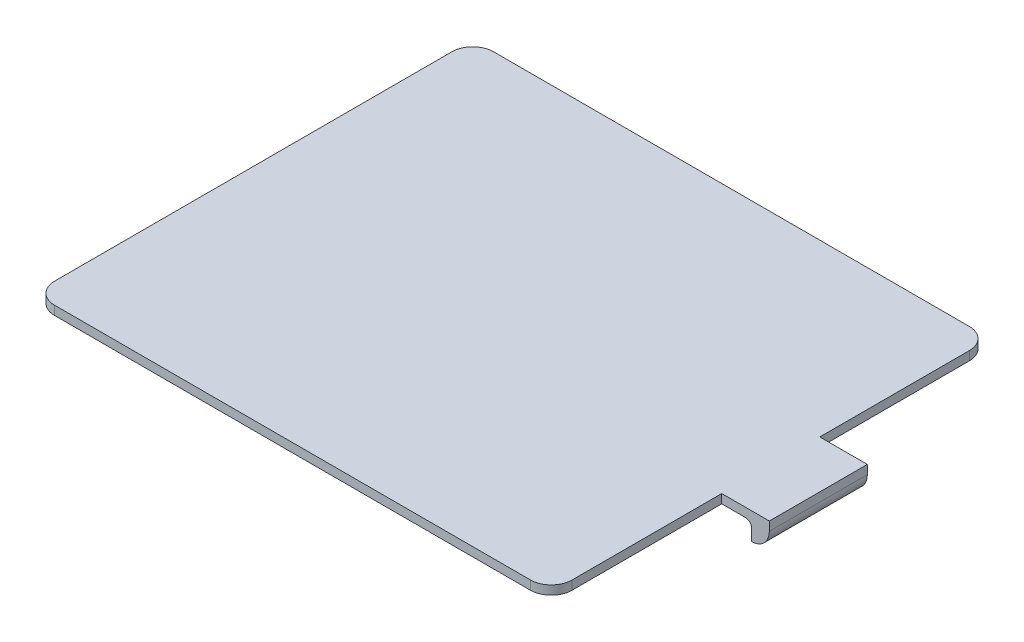
ISO-10303-21;
HEADER;
FILE_DESCRIPTION(('STEP AP214'),'2;1');
FILE_NAME('part.step','',(''),(''),'','','');
FILE_SCHEMA(('AUTOMOTIVE_DESIGN { 1 0 10303 214 1 1 1 1 }'));
ENDSEC;
DATA;
#1=APPLICATION_CONTEXT('core data for automotive mechanical design processes');
#2=APPLICATION_PROTOCOL_DEFINITION('international standard','automotive_design',2000,#1);
#3=PRODUCT_CONTEXT('',#1,'mechanical');
#4=PRODUCT('Part','Part','',(#3));
#5=PRODUCT_RELATED_PRODUCT_CATEGORY('part','',(#4));
#6=PRODUCT_DEFINITION_FORMATION('','',#4);
#7=PRODUCT_DEFINITION_CONTEXT('part definition',#1,'design');
#8=PRODUCT_DEFINITION('design','',#6,#7);
#9=PRODUCT_DEFINITION_SHAPE('','',#8);
#10=(LENGTH_UNIT() NAMED_UNIT(*) SI_UNIT(.MILLI.,.METRE.));
#11=(NAMED_UNIT(*) PLANE_ANGLE_UNIT() SI_UNIT($,.RADIAN.));
#12=(NAMED_UNIT(*) SI_UNIT($,.STERADIAN.) SOLID_ANGLE_UNIT());
#13=UNCERTAINTY_MEASURE_WITH_UNIT(LENGTH_MEASURE(1.E-05),#10,'distance_accuracy_value','');
#14=(GEOMETRIC_REPRESENTATION_CONTEXT(3) GLOBAL_UNCERTAINTY_ASSIGNED_CONTEXT((#13)) GLOBAL_UNIT_ASSIGNED_CONTEXT((#10,
#11,#12)) REPRESENTATION_CONTEXT('',''));
#15=CARTESIAN_POINT('',(0.,0.,0.));
#16=DIRECTION('',(0.,0.,1.));
#17=DIRECTION('',(1.,0.,0.));
#18=AXIS2_PLACEMENT_3D('',#15,#16,#17);
#19=CARTESIAN_POINT('',(104.902209804421,-36.5,-27.5536747118102));
#20=DIRECTION('',(1.,0.,0.));
#21=DIRECTION('',(0.,0.,-1.));
#22=AXIS2_PLACEMENT_3D('',#19,#20,#21);
#23=PLANE('',#22);
#24=DIRECTION('',(0.,0.,-1.));
#25=VECTOR('',#24,1.);
#26=CARTESIAN_POINT('',(104.902209804421,-35.,-27.5536747118102));
#27=LINE('',#26,#25);
#28=CARTESIAN_POINT('',(104.902209804421,-35.,-2.37681307845837));
#29=VERTEX_POINT('',#28);
#30=CARTESIAN_POINT('',(104.902209804421,-35.,-27.5536747118102));
#31=VERTEX_POINT('',#30);
#32=EDGE_CURVE('E229',#29,#31,#27,.T.);
#33=ORIENTED_EDGE('',*,*,#32,.F.);
#34=DIRECTION('',(0.,1.,0.));
#35=VECTOR('',#34,1.);
#36=CARTESIAN_POINT('',(104.902209804421,-35.,-2.37681307845836));
#37=LINE('',#36,#35);
#38=CARTESIAN_POINT('',(104.902209804421,-36.5,-2.37681307845836));
#39=VERTEX_POINT('',#38);
#40=EDGE_CURVE('E166',#39,#29,#37,.T.);
#41=ORIENTED_EDGE('',*,*,#40,.F.);
#42=DIRECTION('',(0.,0.,-1.));
#43=VECTOR('',#42,1.);
#44=CARTESIAN_POINT('',(104.902209804421,-36.5,-27.5536747118102));
#45=LINE('',#44,#43);
#46=CARTESIAN_POINT('',(104.902209804421,-36.5,-27.5536747118102));
#47=VERTEX_POINT('',#46);
#48=EDGE_CURVE('E204',#39,#47,#45,.T.);
#49=ORIENTED_EDGE('',*,*,#48,.T.);
#50=DIRECTION('',(0.,1.,0.));
#51=VECTOR('',#50,1.);
#52=CARTESIAN_POINT('',(104.902209804421,-36.5,-27.5536747118102));
#53=LINE('',#52,#51);
#54=EDGE_CURVE('E243',#47,#31,#53,.T.);
#55=ORIENTED_EDGE('',*,*,#54,.T.);
#56=EDGE_LOOP('',(#33,#41,#49,#55));
#57=FACE_BOUND('',#56,.T.);
#58=ADVANCED_FACE('F33',(#57),#23,.T.);
#59=CARTESIAN_POINT('',(104.902209804421,-36.5,39.2885481861091));
#60=VERTEX_POINT('',#59);
#61=CARTESIAN_POINT('',(104.902209804421,-36.5,14.1116865527573));
#62=VERTEX_POINT('',#61);
#63=EDGE_CURVE('E205',#60,#62,#45,.T.);
#64=ORIENTED_EDGE('',*,*,#63,.T.);
#65=DIRECTION('',(0.,-1.,0.));
#66=VECTOR('',#65,1.);
#67=CARTESIAN_POINT('',(104.902209804421,-35.,14.1116865527573));
#68=LINE('',#67,#66);
#69=CARTESIAN_POINT('',(104.902209804421,-35.,14.1116865527573));
#70=VERTEX_POINT('',#69);
#71=EDGE_CURVE('E171',#70,#62,#68,.T.);
#72=ORIENTED_EDGE('',*,*,#71,.F.);
#73=CARTESIAN_POINT('',(104.902209804421,-35.,39.2885481861091));
#74=VERTEX_POINT('',#73);
#75=EDGE_CURVE('E230',#74,#70,#27,.T.);
#76=ORIENTED_EDGE('',*,*,#75,.F.);
#77=DIRECTION('',(0.,1.,0.));
#78=VECTOR('',#77,1.);
#79=CARTESIAN_POINT('',(104.902209804421,-36.5,39.2885481861091));
#80=LINE('',#79,#78);
#81=EDGE_CURVE('E246',#60,#74,#80,.T.);
#82=ORIENTED_EDGE('',*,*,#81,.F.);
#83=EDGE_LOOP('',(#64,#72,#76,#82));
#84=FACE_BOUND('',#83,.T.);
#85=ADVANCED_FACE('F267',(#84),#23,.T.);
#86=CARTESIAN_POINT('',(21.3471258960294,-36.5,-27.5536747118102));
#87=DIRECTION('',(0.,1.,0.));
#88=DIRECTION('',(0.,0.,1.));
#89=AXIS2_PLACEMENT_3D('',#86,#87,#88);
#90=CYLINDRICAL_SURFACE('',#89,3.5);
#91=CARTESIAN_POINT('',(21.3471258960294,-35.,-27.5536747118102));
#92=DIRECTION('',(0.,1.,0.));
#93=DIRECTION('',(0.,0.,-1.));
#94=AXIS2_PLACEMENT_3D('',#91,#92,#93);
#95=CIRCLE('',#94,3.5);
#96=CARTESIAN_POINT('',(21.3471258960295,-35.,-31.0536747118102));
#97=VERTEX_POINT('',#96);
#98=CARTESIAN_POINT('',(17.8471258960294,-35.,-27.5536747118102));
#99=VERTEX_POINT('',#98);
#100=EDGE_CURVE('E187',#97,#99,#95,.T.);
#101=ORIENTED_EDGE('',*,*,#100,.F.);
#102=DIRECTION('',(0.,1.,0.));
#103=VECTOR('',#102,1.);
#104=CARTESIAN_POINT('',(21.3471258960295,-36.5,-31.0536747118102));
#105=LINE('',#104,#103);
#106=CARTESIAN_POINT('',(21.3471258960295,-36.5,-31.0536747118102));
#107=VERTEX_POINT('',#106);
#108=EDGE_CURVE('E238',#107,#97,#105,.T.);
#109=ORIENTED_EDGE('',*,*,#108,.F.);
#110=CARTESIAN_POINT('',(21.3471258960294,-36.5,-27.5536747118102));
#111=DIRECTION('',(0.,1.,0.));
#112=DIRECTION('',(0.,0.,-1.));
#113=AXIS2_PLACEMENT_3D('',#110,#111,#112);
#114=CIRCLE('',#113,3.5);
#115=CARTESIAN_POINT('',(17.8471258960294,-36.5,-27.5536747118102));
#116=VERTEX_POINT('',#115);
#117=EDGE_CURVE('E188',#107,#116,#114,.T.);
#118=ORIENTED_EDGE('',*,*,#117,.T.);
#119=DIRECTION('',(0.,1.,0.));
#120=VECTOR('',#119,1.);
#121=CARTESIAN_POINT('',(17.8471258960294,-36.5,-27.5536747118102));
#122=LINE('',#121,#120);
#123=EDGE_CURVE('E214',#116,#99,#122,.T.);
#124=ORIENTED_EDGE('',*,*,#123,.T.);
#125=EDGE_LOOP('',(#101,#109,#118,#124));
#126=FACE_BOUND('',#125,.T.);
#127=ADVANCED_FACE('F288',(#126),#90,.T.);
#128=CARTESIAN_POINT('',(21.3471258960295,-36.5,-31.0536747118102));
#129=DIRECTION('',(0.,0.,-1.));
#130=DIRECTION('',(-1.,0.,0.));
#131=AXIS2_PLACEMENT_3D('',#128,#129,#130);
#132=PLANE('',#131);
#133=DIRECTION('',(-1.,0.,0.));
#134=VECTOR('',#133,1.);
#135=CARTESIAN_POINT('',(21.3471258960295,-35.,-31.0536747118102));
#136=LINE('',#135,#134);
#137=CARTESIAN_POINT('',(101.402209804421,-35.,-31.0536747118102));
#138=VERTEX_POINT('',#137);
#139=EDGE_CURVE('E192',#138,#97,#136,.T.);
#140=ORIENTED_EDGE('',*,*,#139,.F.);
#141=DIRECTION('',(0.,1.,0.));
#142=VECTOR('',#141,1.);
#143=CARTESIAN_POINT('',(101.402209804421,-36.5,-31.0536747118102));
#144=LINE('',#143,#142);
#145=CARTESIAN_POINT('',(101.402209804421,-36.5,-31.0536747118102));
#146=VERTEX_POINT('',#145);
#147=EDGE_CURVE('E241',#146,#138,#144,.T.);
#148=ORIENTED_EDGE('',*,*,#147,.F.);
#149=DIRECTION('',(-1.,0.,0.));
#150=VECTOR('',#149,1.);
#151=CARTESIAN_POINT('',(21.3471258960295,-36.5,-31.0536747118102));
#152=LINE('',#151,#150);
#153=EDGE_CURVE('E211',#146,#107,#152,.T.);
#154=ORIENTED_EDGE('',*,*,#153,.T.);
#155=ORIENTED_EDGE('',*,*,#108,.T.);
#156=EDGE_LOOP('',(#140,#148,#154,#155));
#157=FACE_BOUND('',#156,.T.);
#158=ADVANCED_FACE('F308',(#157),#132,.T.);
#159=CARTESIAN_POINT('',(101.402209804421,-36.5,-27.5536747118102));
#160=DIRECTION('',(0.,1.,0.));
#161=DIRECTION('',(0.,0.,1.));
#162=AXIS2_PLACEMENT_3D('',#159,#160,#161);
#163=CYLINDRICAL_SURFACE('',#162,3.5);
#164=CARTESIAN_POINT('',(101.402209804421,-35.,-27.5536747118102));
#165=DIRECTION('',(0.,1.,0.));
#166=DIRECTION('',(0.,0.,1.));
#167=AXIS2_PLACEMENT_3D('',#164,#165,#166);
#168=CIRCLE('',#167,3.5);
#169=EDGE_CURVE('E233',#31,#138,#168,.T.);
#170=ORIENTED_EDGE('',*,*,#169,.F.);
#171=ORIENTED_EDGE('',*,*,#54,.F.);
#172=CARTESIAN_POINT('',(101.402209804421,-36.5,-27.5536747118102));
#173=DIRECTION('',(0.,1.,0.));
#174=DIRECTION('',(0.,0.,1.));
#175=AXIS2_PLACEMENT_3D('',#172,#173,#174);
#176=CIRCLE('',#175,3.5);
#177=EDGE_CURVE('E208',#47,#146,#176,.T.);
#178=ORIENTED_EDGE('',*,*,#177,.T.);
#179=ORIENTED_EDGE('',*,*,#147,.T.);
#180=EDGE_LOOP('',(#170,#171,#178,#179));
#181=FACE_BOUND('',#180,.T.);
#182=ADVANCED_FACE('F292',(#181),#163,.T.);
#183=CARTESIAN_POINT('',(101.402209804421,-36.5,39.2885481861091));
#184=DIRECTION('',(0.,1.,0.));
#185=DIRECTION('',(0.,0.,1.));
#186=AXIS2_PLACEMENT_3D('',#183,#184,#185);
#187=CYLINDRICAL_SURFACE('',#186,3.5);
#188=CARTESIAN_POINT('',(101.402209804421,-35.,39.2885481861091));
#189=DIRECTION('',(0.,1.,0.));
#190=DIRECTION('',(0.,0.,1.));
#191=AXIS2_PLACEMENT_3D('',#188,#189,#190);
#192=CIRCLE('',#191,3.5);
#193=CARTESIAN_POINT('',(101.402209804421,-35.,42.7885481861091));
#194=VERTEX_POINT('',#193);
#195=EDGE_CURVE('E226',#194,#74,#192,.T.);
#196=ORIENTED_EDGE('',*,*,#195,.F.);
#197=DIRECTION('',(0.,1.,0.));
#198=VECTOR('',#197,1.);
#199=CARTESIAN_POINT('',(101.402209804421,-36.5,42.7885481861091));
#200=LINE('',#199,#198);
#201=CARTESIAN_POINT('',(101.402209804421,-36.5,42.7885481861091));
#202=VERTEX_POINT('',#201);
#203=EDGE_CURVE('E248',#202,#194,#200,.T.);
#204=ORIENTED_EDGE('',*,*,#203,.F.);
#205=CARTESIAN_POINT('',(101.402209804421,-36.5,39.2885481861091));
#206=DIRECTION('',(0.,1.,0.));
#207=DIRECTION('',(0.,0.,1.));
#208=AXIS2_PLACEMENT_3D('',#205,#206,#207);
#209=CIRCLE('',#208,3.5);
#210=EDGE_CURVE('E201',#202,#60,#209,.T.);
#211=ORIENTED_EDGE('',*,*,#210,.T.);
#212=ORIENTED_EDGE('',*,*,#81,.T.);
#213=EDGE_LOOP('',(#196,#204,#211,#212));
#214=FACE_BOUND('',#213,.T.);
#215=ADVANCED_FACE('F273',(#214),#187,.T.);
#216=CARTESIAN_POINT('',(21.3471258960295,-36.5,42.7885481861091));
#217=DIRECTION('',(0.,0.,1.));
#218=DIRECTION('',(1.,0.,0.));
#219=AXIS2_PLACEMENT_3D('',#216,#217,#218);
#220=PLANE('',#219);
#221=DIRECTION('',(1.,0.,0.));
#222=VECTOR('',#221,1.);
#223=CARTESIAN_POINT('',(21.3471258960295,-35.,42.7885481861091));
#224=LINE('',#223,#222);
#225=CARTESIAN_POINT('',(21.3471258960294,-35.,42.7885481861091));
#226=VERTEX_POINT('',#225);
#227=EDGE_CURVE('E223',#226,#194,#224,.T.);
#228=ORIENTED_EDGE('',*,*,#227,.F.);
#229=DIRECTION('',(0.,1.,0.));
#230=VECTOR('',#229,1.);
#231=CARTESIAN_POINT('',(21.3471258960294,-36.5,42.7885481861091));
#232=LINE('',#231,#230);
#233=CARTESIAN_POINT('',(21.3471258960294,-36.5,42.7885481861091));
#234=VERTEX_POINT('',#233);
#235=EDGE_CURVE('E250',#234,#226,#232,.T.);
#236=ORIENTED_EDGE('',*,*,#235,.F.);
#237=DIRECTION('',(1.,0.,0.));
#238=VECTOR('',#237,1.);
#239=CARTESIAN_POINT('',(21.3471258960295,-36.5,42.7885481861091));
#240=LINE('',#239,#238);
#241=EDGE_CURVE('E198',#234,#202,#240,.T.);
#242=ORIENTED_EDGE('',*,*,#241,.T.);
#243=ORIENTED_EDGE('',*,*,#203,.T.);
#244=EDGE_LOOP('',(#228,#236,#242,#243));
#245=FACE_BOUND('',#244,.T.);
#246=ADVANCED_FACE('F296',(#245),#220,.T.);
#247=CARTESIAN_POINT('',(21.3471258960294,-36.5,39.2885481861091));
#248=DIRECTION('',(0.,1.,0.));
#249=DIRECTION('',(0.,0.,1.));
#250=AXIS2_PLACEMENT_3D('',#247,#248,#249);
#251=CYLINDRICAL_SURFACE('',#250,3.5);
#252=CARTESIAN_POINT('',(21.3471258960294,-35.,39.2885481861091));
#253=DIRECTION('',(0.,1.,0.));
#254=DIRECTION('',(0.,0.,1.));
#255=AXIS2_PLACEMENT_3D('',#252,#253,#254);
#256=CIRCLE('',#255,3.5);
#257=CARTESIAN_POINT('',(17.8471258960294,-35.,39.2885481861091));
#258=VERTEX_POINT('',#257);
#259=EDGE_CURVE('E220',#258,#226,#256,.T.);
#260=ORIENTED_EDGE('',*,*,#259,.F.);
#261=DIRECTION('',(0.,1.,0.));
#262=VECTOR('',#261,1.);
#263=CARTESIAN_POINT('',(17.8471258960294,-36.5,39.2885481861091));
#264=LINE('',#263,#262);
#265=CARTESIAN_POINT('',(17.8471258960294,-36.5,39.2885481861091));
#266=VERTEX_POINT('',#265);
#267=EDGE_CURVE('E252',#266,#258,#264,.T.);
#268=ORIENTED_EDGE('',*,*,#267,.F.);
#269=CARTESIAN_POINT('',(21.3471258960294,-36.5,39.2885481861091));
#270=DIRECTION('',(0.,1.,0.));
#271=DIRECTION('',(0.,0.,1.));
#272=AXIS2_PLACEMENT_3D('',#269,#270,#271);
#273=CIRCLE('',#272,3.5);
#274=EDGE_CURVE('E195',#266,#234,#273,.T.);
#275=ORIENTED_EDGE('',*,*,#274,.T.);
#276=ORIENTED_EDGE('',*,*,#235,.T.);
#277=EDGE_LOOP('',(#260,#268,#275,#276));
#278=FACE_BOUND('',#277,.T.);
#279=ADVANCED_FACE('F299',(#278),#251,.T.);
#280=CARTESIAN_POINT('',(17.8471258960294,-36.5,-27.5536747118102));
#281=DIRECTION('',(-1.,0.,0.));
#282=DIRECTION('',(0.,0.,1.));
#283=AXIS2_PLACEMENT_3D('',#280,#281,#282);
#284=PLANE('',#283);
#285=DIRECTION('',(0.,0.,1.));
#286=VECTOR('',#285,1.);
#287=CARTESIAN_POINT('',(17.8471258960294,-35.,-27.5536747118102));
#288=LINE('',#287,#286);
#289=EDGE_CURVE('E217',#99,#258,#288,.T.);
#290=ORIENTED_EDGE('',*,*,#289,.F.);
#291=ORIENTED_EDGE('',*,*,#123,.F.);
#292=DIRECTION('',(0.,0.,1.));
#293=VECTOR('',#292,1.);
#294=CARTESIAN_POINT('',(17.8471258960294,-36.5,-27.5536747118102));
#295=LINE('',#294,#293);
#296=EDGE_CURVE('E191',#116,#266,#295,.T.);
#297=ORIENTED_EDGE('',*,*,#296,.T.);
#298=ORIENTED_EDGE('',*,*,#267,.T.);
#299=EDGE_LOOP('',(#290,#291,#297,#298));
#300=FACE_BOUND('',#299,.T.);
#301=ADVANCED_FACE('F303',(#300),#284,.T.);
#302=CARTESIAN_POINT('',(21.3471258960294,-36.5,-27.5536747118102));
#303=DIRECTION('',(0.,-1.,0.));
#304=DIRECTION('',(0.,0.,-1.));
#305=AXIS2_PLACEMENT_3D('',#302,#303,#304);
#306=PLANE('',#305);
#307=DIRECTION('',(-1.,0.,0.));
#308=VECTOR('',#307,1.);
#309=CARTESIAN_POINT('',(112.902209804421,-36.5,-2.37681307845836));
#310=LINE('',#309,#308);
#311=CARTESIAN_POINT('',(108.919885732905,-36.5,-2.37681307845836));
#312=VERTEX_POINT('',#311);
#313=EDGE_CURVE('E176',#312,#39,#310,.T.);
#314=ORIENTED_EDGE('',*,*,#313,.F.);
#315=DIRECTION('',(0.,0.,-1.));
#316=VECTOR('',#315,1.);
#317=CARTESIAN_POINT('',(108.919885732905,-36.5,-27.5536747118102));
#318=LINE('',#317,#316);
#319=CARTESIAN_POINT('',(108.919885732905,-36.5,14.1116865527573));
#320=VERTEX_POINT('',#319);
#321=EDGE_CURVE('E54',#312,#320,#318,.F.);
#322=ORIENTED_EDGE('',*,*,#321,.T.);
#323=DIRECTION('',(-1.,0.,0.));
#324=VECTOR('',#323,1.);
#325=CARTESIAN_POINT('',(112.902209804421,-36.5,14.1116865527573));
#326=LINE('',#325,#324);
#327=EDGE_CURVE('E180',#320,#62,#326,.T.);
#328=ORIENTED_EDGE('',*,*,#327,.T.);
#329=ORIENTED_EDGE('',*,*,#63,.F.);
#330=ORIENTED_EDGE('',*,*,#210,.F.);
#331=ORIENTED_EDGE('',*,*,#241,.F.);
#332=ORIENTED_EDGE('',*,*,#274,.F.);
#333=ORIENTED_EDGE('',*,*,#296,.F.);
#334=ORIENTED_EDGE('',*,*,#117,.F.);
#335=ORIENTED_EDGE('',*,*,#153,.F.);
#336=ORIENTED_EDGE('',*,*,#177,.F.);
#337=ORIENTED_EDGE('',*,*,#48,.F.);
#338=EDGE_LOOP('',(#314,#322,#328,#329,#330,#331,#332,#333,#334,#335,#336,#337));
#339=FACE_BOUND('',#338,.T.);
#340=ADVANCED_FACE('F275',(#339),#306,.T.);
#341=CARTESIAN_POINT('',(21.3471258960294,-35.,-27.5536747118102));
#342=DIRECTION('',(0.,-1.,0.));
#343=DIRECTION('',(0.,0.,-1.));
#344=AXIS2_PLACEMENT_3D('',#341,#342,#343);
#345=PLANE('',#344);
#346=ORIENTED_EDGE('',*,*,#100,.T.);
#347=ORIENTED_EDGE('',*,*,#289,.T.);
#348=ORIENTED_EDGE('',*,*,#259,.T.);
#349=ORIENTED_EDGE('',*,*,#227,.T.);
#350=ORIENTED_EDGE('',*,*,#195,.T.);
#351=ORIENTED_EDGE('',*,*,#75,.T.);
#352=DIRECTION('',(-1.,0.,0.));
#353=VECTOR('',#352,1.);
#354=CARTESIAN_POINT('',(112.902209804421,-35.,14.1116865527573));
#355=LINE('',#354,#353);
#356=CARTESIAN_POINT('',(112.902209804421,-35.,14.1116865527573));
#357=VERTEX_POINT('',#356);
#358=EDGE_CURVE('E182',#357,#70,#355,.T.);
#359=ORIENTED_EDGE('',*,*,#358,.F.);
#360=DIRECTION('',(0.,0.,1.));
#361=VECTOR('',#360,1.);
#362=CARTESIAN_POINT('',(112.902209804421,-35.,14.1116865527573));
#363=LINE('',#362,#361);
#364=CARTESIAN_POINT('',(112.902209804421,-35.,-2.37681307845836));
#365=VERTEX_POINT('',#364);
#366=EDGE_CURVE('E170',#365,#357,#363,.T.);
#367=ORIENTED_EDGE('',*,*,#366,.F.);
#368=DIRECTION('',(-1.,0.,0.));
#369=VECTOR('',#368,1.);
#370=CARTESIAN_POINT('',(112.902209804421,-35.,-2.37681307845836));
#371=LINE('',#370,#369);
#372=EDGE_CURVE('E184',#365,#29,#371,.T.);
#373=ORIENTED_EDGE('',*,*,#372,.T.);
#374=ORIENTED_EDGE('',*,*,#32,.T.);
#375=ORIENTED_EDGE('',*,*,#169,.T.);
#376=ORIENTED_EDGE('',*,*,#139,.T.);
#377=EDGE_LOOP('',(#346,#347,#348,#349,#350,#351,#359,#367,#373,#374,#375,#376));
#378=FACE_BOUND('',#377,.T.);
#379=ADVANCED_FACE('F269',(#378),#345,.F.);
#380=CARTESIAN_POINT('',(112.902209804421,-35.,-2.37681307845836));
#381=DIRECTION('',(0.,0.,1.));
#382=DIRECTION('',(1.,0.,0.));
#383=AXIS2_PLACEMENT_3D('',#380,#381,#382);
#384=PLANE('',#383);
#385=ORIENTED_EDGE('',*,*,#40,.T.);
#386=ORIENTED_EDGE('',*,*,#372,.F.);
#387=DIRECTION('',(0.,1.,0.));
#388=VECTOR('',#387,1.);
#389=CARTESIAN_POINT('',(112.902209804421,-35.,-2.37681307845836));
#390=LINE('',#389,#388);
#391=CARTESIAN_POINT('',(112.902209804421,-36.5,-2.37681307845836));
#392=VERTEX_POINT('',#391);
#393=EDGE_CURVE('E167',#392,#365,#390,.T.);
#394=ORIENTED_EDGE('',*,*,#393,.F.);
#395=CARTESIAN_POINT('',(109.919885732905,-36.5,-2.37681307845836));
#396=DIRECTION('',(0.,0.,1.));
#397=DIRECTION('',(1.,0.,0.));
#398=AXIS2_PLACEMENT_3D('',#395,#396,#397);
#399=CIRCLE('',#398,2.98232407151579);
#400=CARTESIAN_POINT('',(109.919885732905,-39.4823240715158,-2.37681307845836));
#401=VERTEX_POINT('',#400);
#402=EDGE_CURVE('E148',#401,#392,#399,.T.);
#403=ORIENTED_EDGE('',*,*,#402,.F.);
#404=DIRECTION('',(0.,-1.,0.));
#405=VECTOR('',#404,1.);
#406=CARTESIAN_POINT('',(109.919885732905,-39.4823240715158,-2.37681307845836));
#407=LINE('',#406,#405);
#408=CARTESIAN_POINT('',(109.919885732905,-37.5,-2.37681307845836));
#409=VERTEX_POINT('',#408);
#410=EDGE_CURVE('E149',#409,#401,#407,.T.);
#411=ORIENTED_EDGE('',*,*,#410,.F.);
#412=CARTESIAN_POINT('',(108.919885732905,-37.5,-2.37681307845836));
#413=DIRECTION('',(0.,0.,1.));
#414=DIRECTION('',(1.,0.,0.));
#415=AXIS2_PLACEMENT_3D('',#412,#413,#414);
#416=CIRCLE('',#415,1.);
#417=EDGE_CURVE('E41',#409,#312,#416,.T.);
#418=ORIENTED_EDGE('',*,*,#417,.T.);
#419=ORIENTED_EDGE('',*,*,#313,.T.);
#420=EDGE_LOOP('',(#385,#386,#394,#403,#411,#418,#419));
#421=FACE_BOUND('',#420,.T.);
#422=ADVANCED_FACE('F257',(#421),#384,.F.);
#423=CARTESIAN_POINT('',(112.902209804421,-35.,14.1116865527573));
#424=DIRECTION('',(0.,0.,-1.));
#425=DIRECTION('',(-1.,0.,0.));
#426=AXIS2_PLACEMENT_3D('',#423,#424,#425);
#427=PLANE('',#426);
#428=ORIENTED_EDGE('',*,*,#71,.T.);
#429=ORIENTED_EDGE('',*,*,#327,.F.);
#430=CARTESIAN_POINT('',(108.919885732905,-37.5,14.1116865527573));
#431=DIRECTION('',(0.,0.,-1.));
#432=DIRECTION('',(-1.,0.,0.));
#433=AXIS2_PLACEMENT_3D('',#430,#431,#432);
#434=CIRCLE('',#433,1.);
#435=CARTESIAN_POINT('',(109.919885732905,-37.5,14.1116865527573));
#436=VERTEX_POINT('',#435);
#437=EDGE_CURVE('E11',#320,#436,#434,.T.);
#438=ORIENTED_EDGE('',*,*,#437,.T.);
#439=DIRECTION('',(0.,1.,0.));
#440=VECTOR('',#439,1.);
#441=CARTESIAN_POINT('',(109.919885732905,-39.4823240715158,14.1116865527573));
#442=LINE('',#441,#440);
#443=CARTESIAN_POINT('',(109.919885732905,-39.4823240715158,14.1116865527573));
#444=VERTEX_POINT('',#443);
#445=EDGE_CURVE('E152',#444,#436,#442,.T.);
#446=ORIENTED_EDGE('',*,*,#445,.F.);
#447=CARTESIAN_POINT('',(109.919885732905,-36.5,14.1116865527573));
#448=DIRECTION('',(0.,0.,1.));
#449=DIRECTION('',(1.,0.,0.));
#450=AXIS2_PLACEMENT_3D('',#447,#448,#449);
#451=CIRCLE('',#450,2.98232407151579);
#452=CARTESIAN_POINT('',(112.902209804421,-36.5,14.1116865527573));
#453=VERTEX_POINT('',#452);
#454=EDGE_CURVE('E139',#444,#453,#451,.T.);
#455=ORIENTED_EDGE('',*,*,#454,.T.);
#456=DIRECTION('',(0.,-1.,0.));
#457=VECTOR('',#456,1.);
#458=CARTESIAN_POINT('',(112.902209804421,-35.,14.1116865527573));
#459=LINE('',#458,#457);
#460=EDGE_CURVE('E173',#357,#453,#459,.T.);
#461=ORIENTED_EDGE('',*,*,#460,.F.);
#462=ORIENTED_EDGE('',*,*,#358,.T.);
#463=EDGE_LOOP('',(#428,#429,#438,#446,#455,#461,#462));
#464=FACE_BOUND('',#463,.T.);
#465=ADVANCED_FACE('F154',(#464),#427,.F.);
#466=CARTESIAN_POINT('',(112.902209804421,0.,0.));
#467=DIRECTION('',(1.,0.,0.));
#468=DIRECTION('',(0.,0.,-1.));
#469=AXIS2_PLACEMENT_3D('',#466,#467,#468);
#470=PLANE('',#469);
#471=ORIENTED_EDGE('',*,*,#393,.T.);
#472=ORIENTED_EDGE('',*,*,#366,.T.);
#473=ORIENTED_EDGE('',*,*,#460,.T.);
#474=DIRECTION('',(0.,0.,-1.));
#475=VECTOR('',#474,1.);
#476=CARTESIAN_POINT('',(112.902209804421,-36.5,14.1116865527573));
#477=LINE('',#476,#475);
#478=EDGE_CURVE('E145',#453,#392,#477,.T.);
#479=ORIENTED_EDGE('',*,*,#478,.T.);
#480=EDGE_LOOP('',(#471,#472,#473,#479));
#481=FACE_BOUND('',#480,.T.);
#482=ADVANCED_FACE('F261',(#481),#470,.T.);
#483=CARTESIAN_POINT('',(109.919885732905,-36.5,14.1116865527573));
#484=DIRECTION('',(0.,0.,1.));
#485=DIRECTION('',(1.,0.,0.));
#486=AXIS2_PLACEMENT_3D('',#483,#484,#485);
#487=CYLINDRICAL_SURFACE('',#486,2.98232407151579);
#488=ORIENTED_EDGE('',*,*,#402,.T.);
#489=ORIENTED_EDGE('',*,*,#478,.F.);
#490=ORIENTED_EDGE('',*,*,#454,.F.);
#491=DIRECTION('',(0.,0.,1.));
#492=VECTOR('',#491,1.);
#493=CARTESIAN_POINT('',(109.919885732905,-39.4823240715158,14.1116865527573));
#494=LINE('',#493,#492);
#495=EDGE_CURVE('E144',#401,#444,#494,.T.);
#496=ORIENTED_EDGE('',*,*,#495,.F.);
#497=EDGE_LOOP('',(#488,#489,#490,#496));
#498=FACE_BOUND('',#497,.T.);
#499=ADVANCED_FACE('F142',(#498),#487,.T.);
#500=CARTESIAN_POINT('',(109.919885732905,73.4198857329048,0.));
#501=DIRECTION('',(1.,0.,0.));
#502=DIRECTION('',(0.,0.,1.));
#503=AXIS2_PLACEMENT_3D('',#500,#501,#502);
#504=PLANE('',#503);
#505=ORIENTED_EDGE('',*,*,#445,.T.);
#506=DIRECTION('',(0.,0.,-1.));
#507=VECTOR('',#506,1.);
#508=CARTESIAN_POINT('',(109.919885732905,-37.5,0.));
#509=LINE('',#508,#507);
#510=EDGE_CURVE('E240',#436,#409,#509,.T.);
#511=ORIENTED_EDGE('',*,*,#510,.T.);
#512=ORIENTED_EDGE('',*,*,#410,.T.);
#513=ORIENTED_EDGE('',*,*,#495,.T.);
#514=EDGE_LOOP('',(#505,#511,#512,#513));
#515=FACE_BOUND('',#514,.T.);
#516=ADVANCED_FACE('F160',(#515),#504,.F.);
#517=CARTESIAN_POINT('',(108.919885732905,-37.5,0.));
#518=DIRECTION('',(0.,0.,-1.));
#519=DIRECTION('',(-1.,0.,0.));
#520=AXIS2_PLACEMENT_3D('',#517,#518,#519);
#521=CYLINDRICAL_SURFACE('',#520,1.);
#522=ORIENTED_EDGE('',*,*,#437,.F.);
#523=ORIENTED_EDGE('',*,*,#321,.F.);
#524=ORIENTED_EDGE('',*,*,#417,.F.);
#525=ORIENTED_EDGE('',*,*,#510,.F.);
#526=EDGE_LOOP('',(#522,#523,#524,#525));
#527=FACE_BOUND('',#526,.T.);
#528=ADVANCED_FACE('F35',(#527),#521,.F.);
#529=CLOSED_SHELL('',(#58,#85,#127,#158,#182,#215,#246,#279,#301,#340,#379,#422,#465,#482,#499,
#516,#528));
#530=MANIFOLD_SOLID_BREP('B2',#529);
#531=ADVANCED_BREP_SHAPE_REPRESENTATION('',(#18,#530),#14);
#532=SHAPE_DEFINITION_REPRESENTATION(#9,#531);
ENDSEC;
END-ISO-10303-21;
